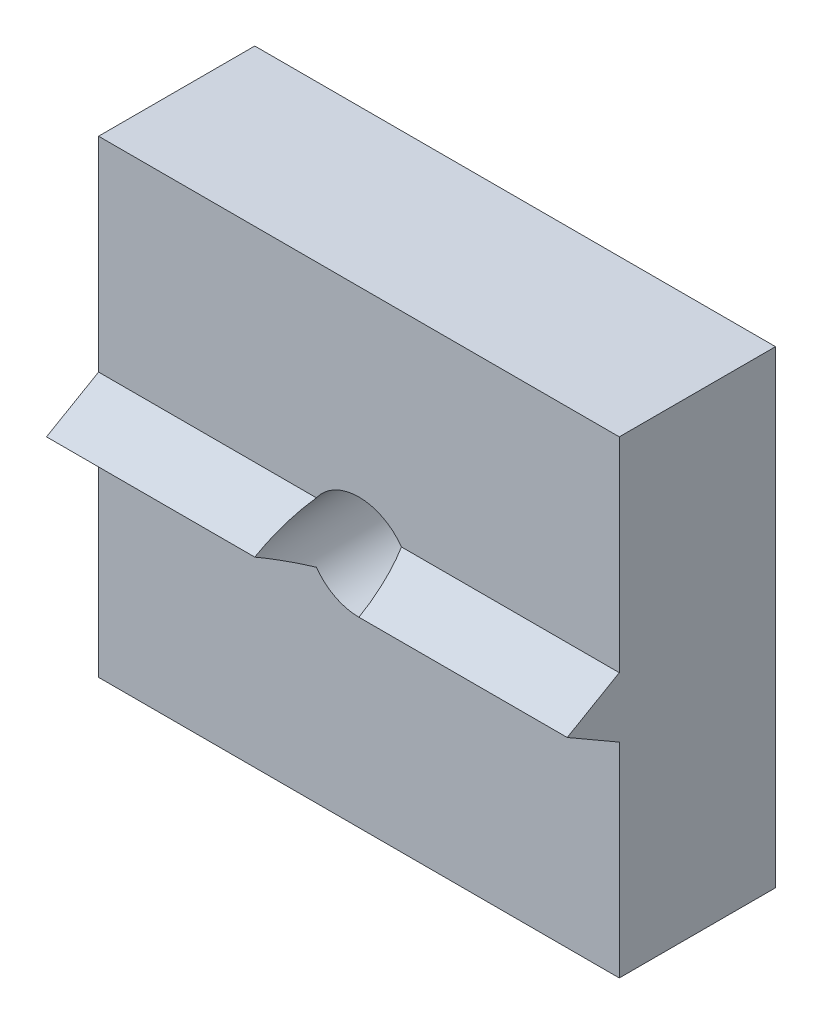
ISO-10303-21;
HEADER;
FILE_DESCRIPTION(('STEP AP214'),'2;1');
FILE_NAME('part.step','',(''),(''),'','','');
FILE_SCHEMA(('AUTOMOTIVE_DESIGN { 1 0 10303 214 1 1 1 1 }'));
ENDSEC;
DATA;
#1=APPLICATION_CONTEXT('core data for automotive mechanical design processes');
#2=APPLICATION_PROTOCOL_DEFINITION('international standard','automotive_design',2000,#1);
#3=PRODUCT_CONTEXT('',#1,'mechanical');
#4=PRODUCT('Part','Part','',(#3));
#5=PRODUCT_RELATED_PRODUCT_CATEGORY('part','',(#4));
#6=PRODUCT_DEFINITION_FORMATION('','',#4);
#7=PRODUCT_DEFINITION_CONTEXT('part definition',#1,'design');
#8=PRODUCT_DEFINITION('design','',#6,#7);
#9=PRODUCT_DEFINITION_SHAPE('','',#8);
#10=(LENGTH_UNIT() NAMED_UNIT(*) SI_UNIT(.MILLI.,.METRE.));
#11=(NAMED_UNIT(*) PLANE_ANGLE_UNIT() SI_UNIT($,.RADIAN.));
#12=(NAMED_UNIT(*) SI_UNIT($,.STERADIAN.) SOLID_ANGLE_UNIT());
#13=UNCERTAINTY_MEASURE_WITH_UNIT(LENGTH_MEASURE(1.E-05),#10,'distance_accuracy_value','');
#14=(GEOMETRIC_REPRESENTATION_CONTEXT(3) GLOBAL_UNCERTAINTY_ASSIGNED_CONTEXT((#13)) GLOBAL_UNIT_ASSIGNED_CONTEXT((#10,
#11,#12)) REPRESENTATION_CONTEXT('',''));
#15=CARTESIAN_POINT('',(0.,0.,0.));
#16=DIRECTION('',(0.,0.,1.));
#17=DIRECTION('',(1.,0.,0.));
#18=AXIS2_PLACEMENT_3D('',#15,#16,#17);
#19=CARTESIAN_POINT('',(-7.29128784747792,0.866025403784439,2.5));
#20=DIRECTION('',(0.,0.866025403784439,0.5));
#21=DIRECTION('',(0.,-0.5,0.866025403784439));
#22=AXIS2_PLACEMENT_3D('',#19,#20,#21);
#23=PLANE('',#22);
#24=CARTESIAN_POINT('',(0.,0.,4.));
#25=DIRECTION('',(0.,0.866025403784439,0.5));
#26=DIRECTION('',(0.,0.5,-0.866025403784439));
#27=AXIS2_PLACEMENT_3D('',#24,#25,#26);
#28=ELLIPSE('',#27,2.,1.);
#29=CARTESIAN_POINT('',(-1.00000000000001,0.,4.));
#30=VERTEX_POINT('',#29);
#31=CARTESIAN_POINT('',(-0.816496580927727,0.577350269189625,3.));
#32=VERTEX_POINT('',#31);
#33=EDGE_CURVE('E48',#30,#32,#28,.F.);
#34=ORIENTED_EDGE('',*,*,#33,.T.);
#35=DIRECTION('',(1.,0.,0.));
#36=VECTOR('',#35,1.);
#37=CARTESIAN_POINT('',(0.,0.577350269189625,3.));
#38=LINE('',#37,#36);
#39=CARTESIAN_POINT('',(-5.,0.577350269189625,3.));
#40=VERTEX_POINT('',#39);
#41=EDGE_CURVE('E11',#40,#32,#38,.T.);
#42=ORIENTED_EDGE('',*,*,#41,.F.);
#43=DIRECTION('',(0.,0.5,-0.866025403784439));
#44=VECTOR('',#43,1.);
#45=CARTESIAN_POINT('',(-5.,0.866025403784439,2.5));
#46=LINE('',#45,#44);
#47=CARTESIAN_POINT('',(-5.,0.,4.));
#48=VERTEX_POINT('',#47);
#49=EDGE_CURVE('E165',#48,#40,#46,.T.);
#50=ORIENTED_EDGE('',*,*,#49,.F.);
#51=DIRECTION('',(1.,0.,0.));
#52=VECTOR('',#51,1.);
#53=CARTESIAN_POINT('',(-7.29128784747792,0.,4.));
#54=LINE('',#53,#52);
#55=EDGE_CURVE('E166',#48,#30,#54,.T.);
#56=ORIENTED_EDGE('',*,*,#55,.T.);
#57=EDGE_LOOP('',(#34,#42,#50,#56));
#58=FACE_BOUND('',#57,.T.);
#59=ADVANCED_FACE('F33',(#58),#23,.T.);
#60=CARTESIAN_POINT('',(-7.29128784747792,0.,4.));
#61=DIRECTION('',(0.,-0.866025403784438,0.5));
#62=DIRECTION('',(0.,-0.5,-0.866025403784439));
#63=AXIS2_PLACEMENT_3D('',#60,#61,#62);
#64=PLANE('',#63);
#65=CARTESIAN_POINT('',(0.,0.,4.));
#66=DIRECTION('',(0.,-0.866025403784438,0.5));
#67=DIRECTION('',(0.,-0.5,-0.866025403784439));
#68=AXIS2_PLACEMENT_3D('',#65,#66,#67);
#69=ELLIPSE('',#68,2.,1.);
#70=CARTESIAN_POINT('',(0.999999999999997,0.,4.));
#71=VERTEX_POINT('',#70);
#72=CARTESIAN_POINT('',(0.816496580927726,-0.577350269189625,3.));
#73=VERTEX_POINT('',#72);
#74=EDGE_CURVE('E119',#71,#73,#69,.F.);
#75=ORIENTED_EDGE('',*,*,#74,.T.);
#76=DIRECTION('',(-1.,0.,0.));
#77=VECTOR('',#76,1.);
#78=CARTESIAN_POINT('',(0.,-0.577350269189625,3.));
#79=LINE('',#78,#77);
#80=CARTESIAN_POINT('',(5.,-0.577350269189625,3.));
#81=VERTEX_POINT('',#80);
#82=EDGE_CURVE('E126',#81,#73,#79,.T.);
#83=ORIENTED_EDGE('',*,*,#82,.F.);
#84=DIRECTION('',(0.,-0.5,-0.866025403784438));
#85=VECTOR('',#84,1.);
#86=CARTESIAN_POINT('',(5.,0.,4.));
#87=LINE('',#86,#85);
#88=CARTESIAN_POINT('',(5.,0.,4.));
#89=VERTEX_POINT('',#88);
#90=EDGE_CURVE('E169',#89,#81,#87,.T.);
#91=ORIENTED_EDGE('',*,*,#90,.F.);
#92=EDGE_CURVE('E168',#71,#89,#54,.T.);
#93=ORIENTED_EDGE('',*,*,#92,.F.);
#94=EDGE_LOOP('',(#75,#83,#91,#93));
#95=FACE_BOUND('',#94,.T.);
#96=ADVANCED_FACE('F216',(#95),#64,.T.);
#97=CARTESIAN_POINT('',(0.,0.,3.));
#98=DIRECTION('',(0.,0.,-1.));
#99=DIRECTION('',(-1.,0.,0.));
#100=AXIS2_PLACEMENT_3D('',#97,#98,#99);
#101=PLANE('',#100);
#102=ORIENTED_EDGE('',*,*,#41,.T.);
#103=CARTESIAN_POINT('',(0.,0.,3.));
#104=DIRECTION('',(0.,0.,-1.));
#105=DIRECTION('',(-1.,0.,0.));
#106=AXIS2_PLACEMENT_3D('',#103,#104,#105);
#107=CIRCLE('',#106,1.);
#108=CARTESIAN_POINT('',(0.816496580927727,0.577350269189625,3.));
#109=VERTEX_POINT('',#108);
#110=EDGE_CURVE('E117',#109,#32,#107,.F.);
#111=ORIENTED_EDGE('',*,*,#110,.F.);
#112=CARTESIAN_POINT('',(5.,0.577350269189625,3.));
#113=VERTEX_POINT('',#112);
#114=EDGE_CURVE('E41',#109,#113,#38,.T.);
#115=ORIENTED_EDGE('',*,*,#114,.T.);
#116=DIRECTION('',(0.,1.,0.));
#117=VECTOR('',#116,1.);
#118=CARTESIAN_POINT('',(5.,-4.5,3.));
#119=LINE('',#118,#117);
#120=CARTESIAN_POINT('',(5.,4.5,3.));
#121=VERTEX_POINT('',#120);
#122=EDGE_CURVE('E159',#113,#121,#119,.T.);
#123=ORIENTED_EDGE('',*,*,#122,.T.);
#124=DIRECTION('',(-1.,0.,0.));
#125=VECTOR('',#124,1.);
#126=CARTESIAN_POINT('',(-5.,4.5,3.));
#127=LINE('',#126,#125);
#128=CARTESIAN_POINT('',(-5.,4.5,3.));
#129=VERTEX_POINT('',#128);
#130=EDGE_CURVE('E145',#121,#129,#127,.T.);
#131=ORIENTED_EDGE('',*,*,#130,.T.);
#132=DIRECTION('',(0.,-1.,0.));
#133=VECTOR('',#132,1.);
#134=CARTESIAN_POINT('',(-5.,-4.5,3.));
#135=LINE('',#134,#133);
#136=EDGE_CURVE('E162',#129,#40,#135,.T.);
#137=ORIENTED_EDGE('',*,*,#136,.T.);
#138=EDGE_LOOP('',(#102,#111,#115,#123,#131,#137));
#139=FACE_BOUND('',#138,.T.);
#140=ADVANCED_FACE('F211',(#139),#101,.F.);
#141=CARTESIAN_POINT('',(-5.,-4.5,3.));
#142=DIRECTION('',(1.,0.,0.));
#143=DIRECTION('',(0.,0.,-1.));
#144=AXIS2_PLACEMENT_3D('',#141,#142,#143);
#145=PLANE('',#144);
#146=ORIENTED_EDGE('',*,*,#49,.T.);
#147=ORIENTED_EDGE('',*,*,#136,.F.);
#148=DIRECTION('',(0.,0.,-1.));
#149=VECTOR('',#148,1.);
#150=CARTESIAN_POINT('',(-5.,4.5,3.));
#151=LINE('',#150,#149);
#152=CARTESIAN_POINT('',(-5.,4.5,0.));
#153=VERTEX_POINT('',#152);
#154=EDGE_CURVE('E142',#129,#153,#151,.T.);
#155=ORIENTED_EDGE('',*,*,#154,.T.);
#156=DIRECTION('',(0.,-1.,0.));
#157=VECTOR('',#156,1.);
#158=CARTESIAN_POINT('',(-5.,-4.5,0.));
#159=LINE('',#158,#157);
#160=CARTESIAN_POINT('',(-5.,-4.5,0.));
#161=VERTEX_POINT('',#160);
#162=EDGE_CURVE('E153',#153,#161,#159,.T.);
#163=ORIENTED_EDGE('',*,*,#162,.T.);
#164=DIRECTION('',(0.,0.,-1.));
#165=VECTOR('',#164,1.);
#166=CARTESIAN_POINT('',(-5.,-4.5,3.));
#167=LINE('',#166,#165);
#168=CARTESIAN_POINT('',(-5.,-4.5,3.));
#169=VERTEX_POINT('',#168);
#170=EDGE_CURVE('E132',#169,#161,#167,.T.);
#171=ORIENTED_EDGE('',*,*,#170,.F.);
#172=CARTESIAN_POINT('',(-5.,-0.577350269189625,3.));
#173=VERTEX_POINT('',#172);
#174=EDGE_CURVE('E148',#173,#169,#135,.T.);
#175=ORIENTED_EDGE('',*,*,#174,.F.);
#176=DIRECTION('',(0.,0.5,0.866025403784439));
#177=VECTOR('',#176,1.);
#178=CARTESIAN_POINT('',(-5.,0.,4.));
#179=LINE('',#178,#177);
#180=EDGE_CURVE('E131',#173,#48,#179,.T.);
#181=ORIENTED_EDGE('',*,*,#180,.T.);
#182=EDGE_LOOP('',(#146,#147,#155,#163,#171,#175,#181));
#183=FACE_BOUND('',#182,.T.);
#184=ADVANCED_FACE('F35',(#183),#145,.F.);
#185=CARTESIAN_POINT('',(-5.,-4.5,3.));
#186=DIRECTION('',(0.,1.,0.));
#187=DIRECTION('',(0.,0.,1.));
#188=AXIS2_PLACEMENT_3D('',#185,#186,#187);
#189=PLANE('',#188);
#190=DIRECTION('',(1.,0.,0.));
#191=VECTOR('',#190,1.);
#192=CARTESIAN_POINT('',(-5.,-4.5,0.));
#193=LINE('',#192,#191);
#194=CARTESIAN_POINT('',(5.,-4.5,0.));
#195=VERTEX_POINT('',#194);
#196=EDGE_CURVE('E151',#161,#195,#193,.T.);
#197=ORIENTED_EDGE('',*,*,#196,.T.);
#198=DIRECTION('',(0.,0.,-1.));
#199=VECTOR('',#198,1.);
#200=CARTESIAN_POINT('',(5.,-4.5,3.));
#201=LINE('',#200,#199);
#202=CARTESIAN_POINT('',(5.,-4.5,3.));
#203=VERTEX_POINT('',#202);
#204=EDGE_CURVE('E134',#203,#195,#201,.T.);
#205=ORIENTED_EDGE('',*,*,#204,.F.);
#206=DIRECTION('',(1.,0.,0.));
#207=VECTOR('',#206,1.);
#208=CARTESIAN_POINT('',(-5.,-4.5,3.));
#209=LINE('',#208,#207);
#210=EDGE_CURVE('E160',#169,#203,#209,.T.);
#211=ORIENTED_EDGE('',*,*,#210,.F.);
#212=ORIENTED_EDGE('',*,*,#170,.T.);
#213=EDGE_LOOP('',(#197,#205,#211,#212));
#214=FACE_BOUND('',#213,.T.);
#215=ADVANCED_FACE('F207',(#214),#189,.F.);
#216=CARTESIAN_POINT('',(5.,-4.5,3.));
#217=DIRECTION('',(-1.,0.,0.));
#218=DIRECTION('',(0.,0.,1.));
#219=AXIS2_PLACEMENT_3D('',#216,#217,#218);
#220=PLANE('',#219);
#221=ORIENTED_EDGE('',*,*,#122,.F.);
#222=DIRECTION('',(0.,-0.5,0.866025403784439));
#223=VECTOR('',#222,1.);
#224=CARTESIAN_POINT('',(5.,0.866025403784439,2.5));
#225=LINE('',#224,#223);
#226=EDGE_CURVE('E172',#113,#89,#225,.T.);
#227=ORIENTED_EDGE('',*,*,#226,.T.);
#228=ORIENTED_EDGE('',*,*,#90,.T.);
#229=EDGE_CURVE('E157',#203,#81,#119,.T.);
#230=ORIENTED_EDGE('',*,*,#229,.F.);
#231=ORIENTED_EDGE('',*,*,#204,.T.);
#232=DIRECTION('',(0.,1.,0.));
#233=VECTOR('',#232,1.);
#234=CARTESIAN_POINT('',(5.,-4.5,0.));
#235=LINE('',#234,#233);
#236=CARTESIAN_POINT('',(5.,4.5,0.));
#237=VERTEX_POINT('',#236);
#238=EDGE_CURVE('E149',#195,#237,#235,.T.);
#239=ORIENTED_EDGE('',*,*,#238,.T.);
#240=DIRECTION('',(0.,0.,-1.));
#241=VECTOR('',#240,1.);
#242=CARTESIAN_POINT('',(5.,4.5,3.));
#243=LINE('',#242,#241);
#244=EDGE_CURVE('E139',#121,#237,#243,.T.);
#245=ORIENTED_EDGE('',*,*,#244,.F.);
#246=EDGE_LOOP('',(#221,#227,#228,#230,#231,#239,#245));
#247=FACE_BOUND('',#246,.T.);
#248=ADVANCED_FACE('F201',(#247),#220,.F.);
#249=CARTESIAN_POINT('',(-5.,4.5,3.));
#250=DIRECTION('',(0.,-1.,0.));
#251=DIRECTION('',(0.,0.,-1.));
#252=AXIS2_PLACEMENT_3D('',#249,#250,#251);
#253=PLANE('',#252);
#254=DIRECTION('',(-1.,0.,0.));
#255=VECTOR('',#254,1.);
#256=CARTESIAN_POINT('',(-5.,4.5,0.));
#257=LINE('',#256,#255);
#258=EDGE_CURVE('E146',#237,#153,#257,.T.);
#259=ORIENTED_EDGE('',*,*,#258,.T.);
#260=ORIENTED_EDGE('',*,*,#154,.F.);
#261=ORIENTED_EDGE('',*,*,#130,.F.);
#262=ORIENTED_EDGE('',*,*,#244,.T.);
#263=EDGE_LOOP('',(#259,#260,#261,#262));
#264=FACE_BOUND('',#263,.T.);
#265=ADVANCED_FACE('F198',(#264),#253,.F.);
#266=ORIENTED_EDGE('',*,*,#82,.T.);
#267=CARTESIAN_POINT('',(0.,0.,3.));
#268=DIRECTION('',(0.,0.,-1.));
#269=DIRECTION('',(-1.,0.,0.));
#270=AXIS2_PLACEMENT_3D('',#267,#268,#269);
#271=CIRCLE('',#270,1.);
#272=CARTESIAN_POINT('',(-0.816496580927726,-0.577350269189625,3.));
#273=VERTEX_POINT('',#272);
#274=EDGE_CURVE('E111',#273,#73,#271,.F.);
#275=ORIENTED_EDGE('',*,*,#274,.F.);
#276=EDGE_CURVE('E123',#273,#173,#79,.T.);
#277=ORIENTED_EDGE('',*,*,#276,.T.);
#278=ORIENTED_EDGE('',*,*,#174,.T.);
#279=ORIENTED_EDGE('',*,*,#210,.T.);
#280=ORIENTED_EDGE('',*,*,#229,.T.);
#281=EDGE_LOOP('',(#266,#275,#277,#278,#279,#280));
#282=FACE_BOUND('',#281,.T.);
#283=ADVANCED_FACE('F122',(#282),#101,.F.);
#284=CARTESIAN_POINT('',(0.,0.,0.));
#285=DIRECTION('',(0.,0.,-1.));
#286=DIRECTION('',(-1.,0.,0.));
#287=AXIS2_PLACEMENT_3D('',#284,#285,#286);
#288=PLANE('',#287);
#289=CARTESIAN_POINT('',(0.,0.,0.));
#290=DIRECTION('',(0.,0.,-1.));
#291=DIRECTION('',(-1.,0.,0.));
#292=AXIS2_PLACEMENT_3D('',#289,#290,#291);
#293=CIRCLE('',#292,1.);
#294=CARTESIAN_POINT('',(-1.,0.,0.));
#295=VERTEX_POINT('',#294);
#296=EDGE_CURVE('E180',#295,#295,#293,.T.);
#297=ORIENTED_EDGE('',*,*,#296,.F.);
#298=EDGE_LOOP('',(#297));
#299=FACE_BOUND('',#298,.T.);
#300=ORIENTED_EDGE('',*,*,#162,.F.);
#301=ORIENTED_EDGE('',*,*,#258,.F.);
#302=ORIENTED_EDGE('',*,*,#238,.F.);
#303=ORIENTED_EDGE('',*,*,#196,.F.);
#304=EDGE_LOOP('',(#300,#301,#302,#303));
#305=FACE_BOUND('',#304,.T.);
#306=ADVANCED_FACE('F184',(#299,#305),#288,.T.);
#307=EDGE_CURVE('E127',#109,#71,#28,.F.);
#308=ORIENTED_EDGE('',*,*,#307,.T.);
#309=ORIENTED_EDGE('',*,*,#92,.T.);
#310=ORIENTED_EDGE('',*,*,#226,.F.);
#311=ORIENTED_EDGE('',*,*,#114,.F.);
#312=EDGE_LOOP('',(#308,#309,#310,#311));
#313=FACE_BOUND('',#312,.T.);
#314=ADVANCED_FACE('F187',(#313),#23,.T.);
#315=EDGE_CURVE('E107',#273,#30,#69,.F.);
#316=ORIENTED_EDGE('',*,*,#315,.T.);
#317=ORIENTED_EDGE('',*,*,#55,.F.);
#318=ORIENTED_EDGE('',*,*,#180,.F.);
#319=ORIENTED_EDGE('',*,*,#276,.F.);
#320=EDGE_LOOP('',(#316,#317,#318,#319));
#321=FACE_BOUND('',#320,.T.);
#322=ADVANCED_FACE('F130',(#321),#64,.T.);
#323=CARTESIAN_POINT('',(0.,0.,4.001));
#324=DIRECTION('',(0.,0.,-1.));
#325=DIRECTION('',(-1.,0.,0.));
#326=AXIS2_PLACEMENT_3D('',#323,#324,#325);
#327=CYLINDRICAL_SURFACE('',#326,1.);
#328=ORIENTED_EDGE('',*,*,#315,.F.);
#329=ORIENTED_EDGE('',*,*,#274,.T.);
#330=ORIENTED_EDGE('',*,*,#74,.F.);
#331=ORIENTED_EDGE('',*,*,#307,.F.);
#332=ORIENTED_EDGE('',*,*,#110,.T.);
#333=ORIENTED_EDGE('',*,*,#33,.F.);
#334=EDGE_LOOP('',(#328,#329,#330,#331,#332,#333));
#335=FACE_BOUND('',#334,.T.);
#336=ORIENTED_EDGE('',*,*,#296,.T.);
#337=EDGE_LOOP('',(#336));
#338=FACE_BOUND('',#337,.T.);
#339=ADVANCED_FACE('F109',(#335,#338),#327,.F.);
#340=CLOSED_SHELL('',(#59,#96,#140,#184,#215,#248,#265,#283,#306,#314,#322,#339));
#341=MANIFOLD_SOLID_BREP('B2',#340);
#342=ADVANCED_BREP_SHAPE_REPRESENTATION('',(#18,#341),#14);
#343=SHAPE_DEFINITION_REPRESENTATION(#9,#342);
ENDSEC;
END-ISO-10303-21;
